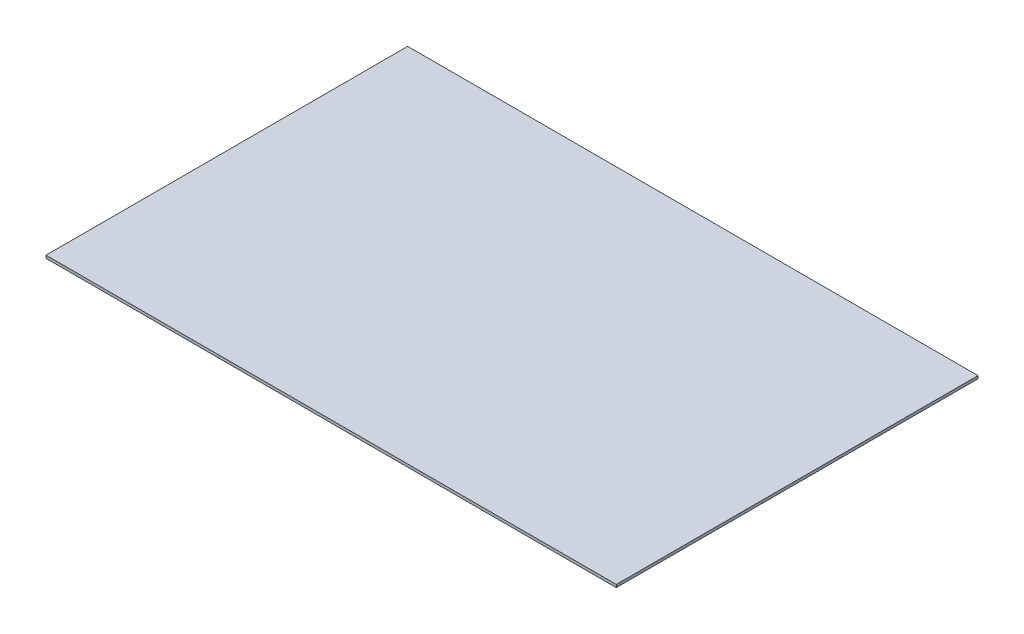
ISO-10303-21;
HEADER;
FILE_DESCRIPTION(('STEP AP214'),'2;1');
FILE_NAME('part.step','',(''),(''),'','','');
FILE_SCHEMA(('AUTOMOTIVE_DESIGN { 1 0 10303 214 1 1 1 1 }'));
ENDSEC;
DATA;
#1=APPLICATION_CONTEXT('core data for automotive mechanical design processes');
#2=APPLICATION_PROTOCOL_DEFINITION('international standard','automotive_design',2000,#1);
#3=PRODUCT_CONTEXT('',#1,'mechanical');
#4=PRODUCT('Part','Part','',(#3));
#5=PRODUCT_RELATED_PRODUCT_CATEGORY('part','',(#4));
#6=PRODUCT_DEFINITION_FORMATION('','',#4);
#7=PRODUCT_DEFINITION_CONTEXT('part definition',#1,'design');
#8=PRODUCT_DEFINITION('design','',#6,#7);
#9=PRODUCT_DEFINITION_SHAPE('','',#8);
#10=(LENGTH_UNIT() NAMED_UNIT(*) SI_UNIT(.MILLI.,.METRE.));
#11=(NAMED_UNIT(*) PLANE_ANGLE_UNIT() SI_UNIT($,.RADIAN.));
#12=(NAMED_UNIT(*) SI_UNIT($,.STERADIAN.) SOLID_ANGLE_UNIT());
#13=UNCERTAINTY_MEASURE_WITH_UNIT(LENGTH_MEASURE(1.E-05),#10,'distance_accuracy_value','');
#14=(GEOMETRIC_REPRESENTATION_CONTEXT(3) GLOBAL_UNCERTAINTY_ASSIGNED_CONTEXT((#13)) GLOBAL_UNIT_ASSIGNED_CONTEXT((#10,
#11,#12)) REPRESENTATION_CONTEXT('',''));
#15=CARTESIAN_POINT('',(0.,0.,0.));
#16=DIRECTION('',(0.,0.,1.));
#17=DIRECTION('',(1.,0.,0.));
#18=AXIS2_PLACEMENT_3D('',#15,#16,#17);
#19=CARTESIAN_POINT('',(257.,1.25,163.));
#20=DIRECTION('',(-1.,0.,0.));
#21=DIRECTION('',(0.,0.,1.));
#22=AXIS2_PLACEMENT_3D('',#19,#20,#21);
#23=PLANE('',#22);
#24=DIRECTION('',(0.,0.,-1.));
#25=VECTOR('',#24,1.);
#26=CARTESIAN_POINT('',(257.,-1.25,163.));
#27=LINE('',#26,#25);
#28=CARTESIAN_POINT('',(257.,-1.25,163.));
#29=VERTEX_POINT('',#28);
#30=CARTESIAN_POINT('',(257.,-1.25,-163.));
#31=VERTEX_POINT('',#30);
#32=EDGE_CURVE('E107',#29,#31,#27,.T.);
#33=ORIENTED_EDGE('',*,*,#32,.T.);
#34=DIRECTION('',(0.,-1.,0.));
#35=VECTOR('',#34,1.);
#36=CARTESIAN_POINT('',(257.,1.25,-163.));
#37=LINE('',#36,#35);
#38=CARTESIAN_POINT('',(257.,1.25,-163.));
#39=VERTEX_POINT('',#38);
#40=EDGE_CURVE('E11',#39,#31,#37,.T.);
#41=ORIENTED_EDGE('',*,*,#40,.F.);
#42=DIRECTION('',(0.,0.,-1.));
#43=VECTOR('',#42,1.);
#44=CARTESIAN_POINT('',(257.,1.25,163.));
#45=LINE('',#44,#43);
#46=CARTESIAN_POINT('',(257.,1.25,163.));
#47=VERTEX_POINT('',#46);
#48=EDGE_CURVE('E91',#47,#39,#45,.T.);
#49=ORIENTED_EDGE('',*,*,#48,.F.);
#50=DIRECTION('',(0.,-1.,0.));
#51=VECTOR('',#50,1.);
#52=CARTESIAN_POINT('',(257.,1.25,163.));
#53=LINE('',#52,#51);
#54=EDGE_CURVE('E103',#47,#29,#53,.T.);
#55=ORIENTED_EDGE('',*,*,#54,.T.);
#56=EDGE_LOOP('',(#33,#41,#49,#55));
#57=FACE_BOUND('',#56,.T.);
#58=ADVANCED_FACE('F39',(#57),#23,.F.);
#59=CARTESIAN_POINT('',(-257.,1.25,-163.));
#60=DIRECTION('',(0.,0.,1.));
#61=DIRECTION('',(1.,0.,0.));
#62=AXIS2_PLACEMENT_3D('',#59,#60,#61);
#63=PLANE('',#62);
#64=DIRECTION('',(-1.,0.,0.));
#65=VECTOR('',#64,1.);
#66=CARTESIAN_POINT('',(-257.,-1.25,-163.));
#67=LINE('',#66,#65);
#68=CARTESIAN_POINT('',(-257.,-1.25,-163.));
#69=VERTEX_POINT('',#68);
#70=EDGE_CURVE('E96',#31,#69,#67,.T.);
#71=ORIENTED_EDGE('',*,*,#70,.T.);
#72=DIRECTION('',(0.,-1.,0.));
#73=VECTOR('',#72,1.);
#74=CARTESIAN_POINT('',(-257.,1.25,-163.));
#75=LINE('',#74,#73);
#76=CARTESIAN_POINT('',(-257.,1.25,-163.));
#77=VERTEX_POINT('',#76);
#78=EDGE_CURVE('E48',#77,#69,#75,.T.);
#79=ORIENTED_EDGE('',*,*,#78,.F.);
#80=DIRECTION('',(-1.,0.,0.));
#81=VECTOR('',#80,1.);
#82=CARTESIAN_POINT('',(-257.,1.25,-163.));
#83=LINE('',#82,#81);
#84=EDGE_CURVE('E86',#39,#77,#83,.T.);
#85=ORIENTED_EDGE('',*,*,#84,.F.);
#86=ORIENTED_EDGE('',*,*,#40,.T.);
#87=EDGE_LOOP('',(#71,#79,#85,#86));
#88=FACE_BOUND('',#87,.T.);
#89=ADVANCED_FACE('F95',(#88),#63,.F.);
#90=CARTESIAN_POINT('',(-257.,1.25,163.));
#91=DIRECTION('',(1.,0.,0.));
#92=DIRECTION('',(0.,0.,-1.));
#93=AXIS2_PLACEMENT_3D('',#90,#91,#92);
#94=PLANE('',#93);
#95=DIRECTION('',(0.,0.,1.));
#96=VECTOR('',#95,1.);
#97=CARTESIAN_POINT('',(-257.,-1.25,163.));
#98=LINE('',#97,#96);
#99=CARTESIAN_POINT('',(-257.,-1.25,163.));
#100=VERTEX_POINT('',#99);
#101=EDGE_CURVE('E73',#69,#100,#98,.T.);
#102=ORIENTED_EDGE('',*,*,#101,.T.);
#103=DIRECTION('',(0.,-1.,0.));
#104=VECTOR('',#103,1.);
#105=CARTESIAN_POINT('',(-257.,1.25,163.));
#106=LINE('',#105,#104);
#107=CARTESIAN_POINT('',(-257.,1.25,163.));
#108=VERTEX_POINT('',#107);
#109=EDGE_CURVE('E98',#108,#100,#106,.T.);
#110=ORIENTED_EDGE('',*,*,#109,.F.);
#111=DIRECTION('',(0.,0.,1.));
#112=VECTOR('',#111,1.);
#113=CARTESIAN_POINT('',(-257.,1.25,163.));
#114=LINE('',#113,#112);
#115=EDGE_CURVE('E89',#77,#108,#114,.T.);
#116=ORIENTED_EDGE('',*,*,#115,.F.);
#117=ORIENTED_EDGE('',*,*,#78,.T.);
#118=EDGE_LOOP('',(#102,#110,#116,#117));
#119=FACE_BOUND('',#118,.T.);
#120=ADVANCED_FACE('F99',(#119),#94,.F.);
#121=CARTESIAN_POINT('',(-257.,1.25,163.));
#122=DIRECTION('',(0.,0.,-1.));
#123=DIRECTION('',(-1.,0.,0.));
#124=AXIS2_PLACEMENT_3D('',#121,#122,#123);
#125=PLANE('',#124);
#126=DIRECTION('',(1.,0.,0.));
#127=VECTOR('',#126,1.);
#128=CARTESIAN_POINT('',(-257.,-1.25,163.));
#129=LINE('',#128,#127);
#130=EDGE_CURVE('E79',#100,#29,#129,.T.);
#131=ORIENTED_EDGE('',*,*,#130,.T.);
#132=ORIENTED_EDGE('',*,*,#54,.F.);
#133=DIRECTION('',(1.,0.,0.));
#134=VECTOR('',#133,1.);
#135=CARTESIAN_POINT('',(-257.,1.25,163.));
#136=LINE('',#135,#134);
#137=EDGE_CURVE('E56',#108,#47,#136,.T.);
#138=ORIENTED_EDGE('',*,*,#137,.F.);
#139=ORIENTED_EDGE('',*,*,#109,.T.);
#140=EDGE_LOOP('',(#131,#132,#138,#139));
#141=FACE_BOUND('',#140,.T.);
#142=ADVANCED_FACE('F120',(#141),#125,.F.);
#143=CARTESIAN_POINT('',(0.,1.25,0.));
#144=DIRECTION('',(0.,-1.,0.));
#145=DIRECTION('',(0.,0.,-1.));
#146=AXIS2_PLACEMENT_3D('',#143,#144,#145);
#147=PLANE('',#146);
#148=ORIENTED_EDGE('',*,*,#48,.T.);
#149=ORIENTED_EDGE('',*,*,#84,.T.);
#150=ORIENTED_EDGE('',*,*,#115,.T.);
#151=ORIENTED_EDGE('',*,*,#137,.T.);
#152=EDGE_LOOP('',(#148,#149,#150,#151));
#153=FACE_BOUND('',#152,.T.);
#154=ADVANCED_FACE('F87',(#153),#147,.F.);
#155=CARTESIAN_POINT('',(0.,-1.25,0.));
#156=DIRECTION('',(0.,-1.,0.));
#157=DIRECTION('',(0.,0.,-1.));
#158=AXIS2_PLACEMENT_3D('',#155,#156,#157);
#159=PLANE('',#158);
#160=ORIENTED_EDGE('',*,*,#32,.F.);
#161=ORIENTED_EDGE('',*,*,#130,.F.);
#162=ORIENTED_EDGE('',*,*,#101,.F.);
#163=ORIENTED_EDGE('',*,*,#70,.F.);
#164=EDGE_LOOP('',(#160,#161,#162,#163));
#165=FACE_BOUND('',#164,.T.);
#166=ADVANCED_FACE('F123',(#165),#159,.T.);
#167=CLOSED_SHELL('',(#58,#89,#120,#142,#154,#166));
#168=MANIFOLD_SOLID_BREP('B2',#167);
#169=ADVANCED_BREP_SHAPE_REPRESENTATION('',(#18,#168),#14);
#170=SHAPE_DEFINITION_REPRESENTATION(#9,#169);
ENDSEC;
END-ISO-10303-21;
